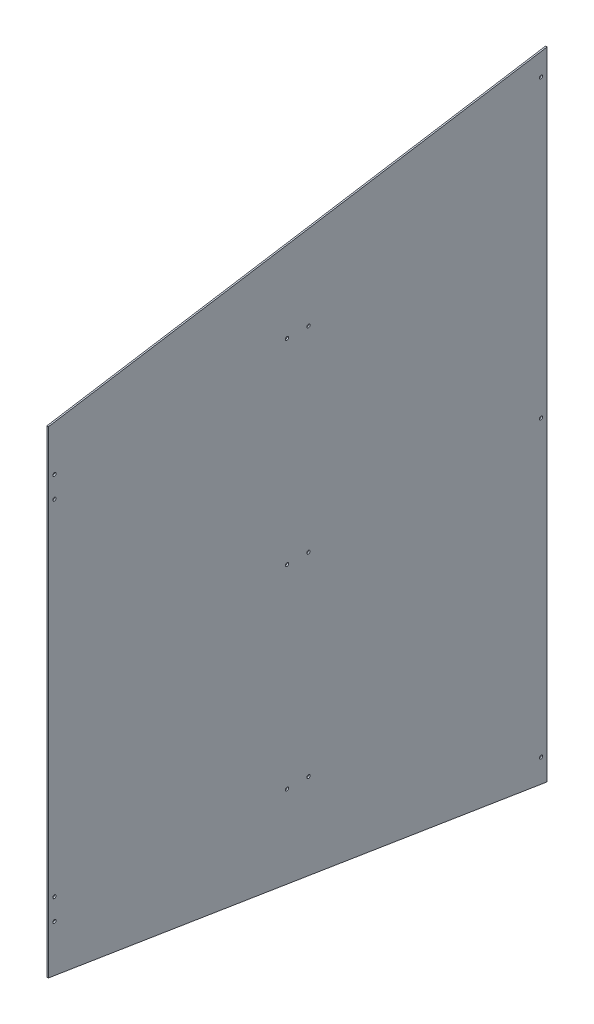
ISO-10303-21;
HEADER;
FILE_DESCRIPTION(('STEP AP214'),'2;1');
FILE_NAME('part.step','',(''),(''),'','','');
FILE_SCHEMA(('AUTOMOTIVE_DESIGN { 1 0 10303 214 1 1 1 1 }'));
ENDSEC;
DATA;
#1=APPLICATION_CONTEXT('core data for automotive mechanical design processes');
#2=APPLICATION_PROTOCOL_DEFINITION('international standard','automotive_design',2000,#1);
#3=PRODUCT_CONTEXT('',#1,'mechanical');
#4=PRODUCT('Part','Part','',(#3));
#5=PRODUCT_RELATED_PRODUCT_CATEGORY('part','',(#4));
#6=PRODUCT_DEFINITION_FORMATION('','',#4);
#7=PRODUCT_DEFINITION_CONTEXT('part definition',#1,'design');
#8=PRODUCT_DEFINITION('design','',#6,#7);
#9=PRODUCT_DEFINITION_SHAPE('','',#8);
#10=(LENGTH_UNIT() NAMED_UNIT(*) SI_UNIT(.MILLI.,.METRE.));
#11=(NAMED_UNIT(*) PLANE_ANGLE_UNIT() SI_UNIT($,.RADIAN.));
#12=(NAMED_UNIT(*) SI_UNIT($,.STERADIAN.) SOLID_ANGLE_UNIT());
#13=UNCERTAINTY_MEASURE_WITH_UNIT(LENGTH_MEASURE(1.E-05),#10,'distance_accuracy_value','');
#14=(GEOMETRIC_REPRESENTATION_CONTEXT(3) GLOBAL_UNCERTAINTY_ASSIGNED_CONTEXT((#13)) GLOBAL_UNIT_ASSIGNED_CONTEXT((#10,
#11,#12)) REPRESENTATION_CONTEXT('',''));
#15=CARTESIAN_POINT('',(0.,0.,0.));
#16=DIRECTION('',(0.,0.,1.));
#17=DIRECTION('',(1.,0.,0.));
#18=AXIS2_PLACEMENT_3D('',#15,#16,#17);
#19=CARTESIAN_POINT('',(3.175,0.,0.));
#20=DIRECTION('',(1.,0.,0.));
#21=DIRECTION('',(0.,0.,-1.));
#22=AXIS2_PLACEMENT_3D('',#19,#20,#21);
#23=PLANE('',#22);
#24=CARTESIAN_POINT('',(3.175,-400.05,1022.35));
#25=DIRECTION('',(1.,0.,0.));
#26=DIRECTION('',(0.,0.,-1.));
#27=AXIS2_PLACEMENT_3D('',#24,#25,#26);
#28=CIRCLE('',#27,3.3655);
#29=CARTESIAN_POINT('',(3.175,-400.05,1018.9845));
#30=VERTEX_POINT('',#29);
#31=EDGE_CURVE('E119',#30,#30,#28,.F.);
#32=ORIENTED_EDGE('',*,*,#31,.T.);
#33=EDGE_LOOP('',(#32));
#34=FACE_BOUND('',#33,.T.);
#35=CARTESIAN_POINT('',(3.175,-355.6,1022.35));
#36=DIRECTION('',(1.,0.,0.));
#37=DIRECTION('',(0.,0.,-1.));
#38=AXIS2_PLACEMENT_3D('',#35,#36,#37);
#39=CIRCLE('',#38,3.3655);
#40=CARTESIAN_POINT('',(3.175,-355.6,1018.9845));
#41=VERTEX_POINT('',#40);
#42=EDGE_CURVE('E122',#41,#41,#39,.F.);
#43=ORIENTED_EDGE('',*,*,#42,.T.);
#44=EDGE_LOOP('',(#43));
#45=FACE_BOUND('',#44,.T.);
#46=CARTESIAN_POINT('',(3.175,358.775,1022.35));
#47=DIRECTION('',(1.,0.,0.));
#48=DIRECTION('',(0.,0.,-1.));
#49=AXIS2_PLACEMENT_3D('',#46,#47,#48);
#50=CIRCLE('',#49,3.3655);
#51=CARTESIAN_POINT('',(3.175,358.775,1018.9845));
#52=VERTEX_POINT('',#51);
#53=EDGE_CURVE('E125',#52,#52,#50,.F.);
#54=ORIENTED_EDGE('',*,*,#53,.T.);
#55=EDGE_LOOP('',(#54));
#56=FACE_BOUND('',#55,.T.);
#57=CARTESIAN_POINT('',(3.175,403.225,1022.35));
#58=DIRECTION('',(1.,0.,0.));
#59=DIRECTION('',(0.,0.,-1.));
#60=AXIS2_PLACEMENT_3D('',#57,#58,#59);
#61=CIRCLE('',#60,3.3655);
#62=CARTESIAN_POINT('',(3.175,403.225,1018.9845));
#63=VERTEX_POINT('',#62);
#64=EDGE_CURVE('E128',#63,#63,#61,.F.);
#65=ORIENTED_EDGE('',*,*,#64,.T.);
#66=EDGE_LOOP('',(#65));
#67=FACE_BOUND('',#66,.T.);
#68=CARTESIAN_POINT('',(3.175,-403.225,539.75));
#69=DIRECTION('',(1.,0.,0.));
#70=DIRECTION('',(0.,0.,-1.));
#71=AXIS2_PLACEMENT_3D('',#68,#69,#70);
#72=CIRCLE('',#71,3.3655);
#73=CARTESIAN_POINT('',(3.175,-403.225,536.3845));
#74=VERTEX_POINT('',#73);
#75=EDGE_CURVE('E131',#74,#74,#72,.F.);
#76=ORIENTED_EDGE('',*,*,#75,.T.);
#77=EDGE_LOOP('',(#76));
#78=FACE_BOUND('',#77,.T.);
#79=CARTESIAN_POINT('',(3.175,-403.225,495.3));
#80=DIRECTION('',(1.,0.,0.));
#81=DIRECTION('',(0.,0.,-1.));
#82=AXIS2_PLACEMENT_3D('',#79,#80,#81);
#83=CIRCLE('',#82,3.3655);
#84=CARTESIAN_POINT('',(3.175,-403.225,491.9345));
#85=VERTEX_POINT('',#84);
#86=EDGE_CURVE('E134',#85,#85,#83,.F.);
#87=ORIENTED_EDGE('',*,*,#86,.T.);
#88=EDGE_LOOP('',(#87));
#89=FACE_BOUND('',#88,.T.);
#90=CARTESIAN_POINT('',(3.175,0.,539.75));
#91=DIRECTION('',(1.,0.,0.));
#92=DIRECTION('',(0.,0.,-1.));
#93=AXIS2_PLACEMENT_3D('',#90,#91,#92);
#94=CIRCLE('',#93,3.3655);
#95=CARTESIAN_POINT('',(3.175,0.,536.3845));
#96=VERTEX_POINT('',#95);
#97=EDGE_CURVE('E137',#96,#96,#94,.F.);
#98=ORIENTED_EDGE('',*,*,#97,.T.);
#99=EDGE_LOOP('',(#98));
#100=FACE_BOUND('',#99,.T.);
#101=CARTESIAN_POINT('',(3.175,0.,495.3));
#102=DIRECTION('',(1.,0.,0.));
#103=DIRECTION('',(0.,0.,-1.));
#104=AXIS2_PLACEMENT_3D('',#101,#102,#103);
#105=CIRCLE('',#104,3.3655);
#106=CARTESIAN_POINT('',(3.175,0.,491.9345));
#107=VERTEX_POINT('',#106);
#108=EDGE_CURVE('E140',#107,#107,#105,.F.);
#109=ORIENTED_EDGE('',*,*,#108,.T.);
#110=EDGE_LOOP('',(#109));
#111=FACE_BOUND('',#110,.T.);
#112=CARTESIAN_POINT('',(3.175,406.4,539.75));
#113=DIRECTION('',(1.,0.,0.));
#114=DIRECTION('',(0.,0.,-1.));
#115=AXIS2_PLACEMENT_3D('',#112,#113,#114);
#116=CIRCLE('',#115,3.3655);
#117=CARTESIAN_POINT('',(3.175,406.4,536.3845));
#118=VERTEX_POINT('',#117);
#119=EDGE_CURVE('E143',#118,#118,#116,.F.);
#120=ORIENTED_EDGE('',*,*,#119,.T.);
#121=EDGE_LOOP('',(#120));
#122=FACE_BOUND('',#121,.T.);
#123=CARTESIAN_POINT('',(3.175,406.4,495.3));
#124=DIRECTION('',(1.,0.,0.));
#125=DIRECTION('',(0.,0.,-1.));
#126=AXIS2_PLACEMENT_3D('',#123,#124,#125);
#127=CIRCLE('',#126,3.3655);
#128=CARTESIAN_POINT('',(3.175,406.4,491.9345));
#129=VERTEX_POINT('',#128);
#130=EDGE_CURVE('E146',#129,#129,#127,.F.);
#131=ORIENTED_EDGE('',*,*,#130,.T.);
#132=EDGE_LOOP('',(#131));
#133=FACE_BOUND('',#132,.T.);
#134=CARTESIAN_POINT('',(3.175,-609.6,12.7));
#135=DIRECTION('',(1.,0.,0.));
#136=DIRECTION('',(0.,0.,-1.));
#137=AXIS2_PLACEMENT_3D('',#134,#135,#136);
#138=CIRCLE('',#137,3.3655);
#139=CARTESIAN_POINT('',(3.175,-609.6,9.3345));
#140=VERTEX_POINT('',#139);
#141=EDGE_CURVE('E149',#140,#140,#138,.F.);
#142=ORIENTED_EDGE('',*,*,#141,.T.);
#143=EDGE_LOOP('',(#142));
#144=FACE_BOUND('',#143,.T.);
#145=CARTESIAN_POINT('',(3.175,0.,12.7));
#146=DIRECTION('',(1.,0.,0.));
#147=DIRECTION('',(0.,0.,-1.));
#148=AXIS2_PLACEMENT_3D('',#145,#146,#147);
#149=CIRCLE('',#148,3.3655);
#150=CARTESIAN_POINT('',(3.175,0.,9.3345));
#151=VERTEX_POINT('',#150);
#152=EDGE_CURVE('E151',#151,#151,#149,.F.);
#153=ORIENTED_EDGE('',*,*,#152,.T.);
#154=EDGE_LOOP('',(#153));
#155=FACE_BOUND('',#154,.T.);
#156=CARTESIAN_POINT('',(3.175,612.775,12.7));
#157=DIRECTION('',(1.,0.,0.));
#158=DIRECTION('',(0.,0.,-1.));
#159=AXIS2_PLACEMENT_3D('',#156,#157,#158);
#160=CIRCLE('',#159,3.3655);
#161=CARTESIAN_POINT('',(3.175,612.775,9.3345));
#162=VERTEX_POINT('',#161);
#163=EDGE_CURVE('E20',#162,#162,#160,.F.);
#164=ORIENTED_EDGE('',*,*,#163,.T.);
#165=EDGE_LOOP('',(#164));
#166=FACE_BOUND('',#165,.T.);
#167=DIRECTION('',(0.,1.,0.));
#168=VECTOR('',#167,1.);
#169=CARTESIAN_POINT('',(3.175,-660.4,0.));
#170=LINE('',#169,#168);
#171=CARTESIAN_POINT('',(3.175,660.4,0.));
#172=VERTEX_POINT('',#171);
#173=CARTESIAN_POINT('',(3.175,-660.399999999999,-1.94289029309402E-13));
#174=VERTEX_POINT('',#173);
#175=EDGE_CURVE('E71',#172,#174,#170,.F.);
#176=ORIENTED_EDGE('',*,*,#175,.F.);
#177=DIRECTION('',(0.,-0.157517910379392,0.987516130455452));
#178=VECTOR('',#177,1.);
#179=CARTESIAN_POINT('',(3.175,660.4,0.));
#180=LINE('',#179,#178);
#181=CARTESIAN_POINT('',(3.175,495.300000000001,1035.05));
#182=VERTEX_POINT('',#181);
#183=EDGE_CURVE('E68',#182,#172,#180,.F.);
#184=ORIENTED_EDGE('',*,*,#183,.F.);
#185=DIRECTION('',(0.,1.,0.));
#186=VECTOR('',#185,1.);
#187=CARTESIAN_POINT('',(3.175,495.3,1035.05));
#188=LINE('',#187,#186);
#189=CARTESIAN_POINT('',(3.175,-495.3,1035.05));
#190=VERTEX_POINT('',#189);
#191=EDGE_CURVE('E59',#190,#182,#188,.T.);
#192=ORIENTED_EDGE('',*,*,#191,.F.);
#193=DIRECTION('',(0.,-0.157517910379392,-0.987516130455452));
#194=VECTOR('',#193,1.);
#195=CARTESIAN_POINT('',(3.175,-495.3,1035.05));
#196=LINE('',#195,#194);
#197=EDGE_CURVE('E54',#174,#190,#196,.F.);
#198=ORIENTED_EDGE('',*,*,#197,.F.);
#199=EDGE_LOOP('',(#176,#184,#192,#198));
#200=FACE_BOUND('',#199,.T.);
#201=ADVANCED_FACE('F17',(#34,#45,#56,#67,#78,#89,#100,#111,#122,#133,#144,#155,#166,#200),#23,.T.);
#202=CARTESIAN_POINT('',(0.,660.4,0.));
#203=DIRECTION('',(0.,0.987516130455452,0.157517910379392));
#204=DIRECTION('',(0.,-0.157517910379392,0.987516130455452));
#205=AXIS2_PLACEMENT_3D('',#202,#203,#204);
#206=PLANE('',#205);
#207=DIRECTION('',(-1.,0.,0.));
#208=VECTOR('',#207,1.);
#209=CARTESIAN_POINT('',(0.,660.4,0.));
#210=LINE('',#209,#208);
#211=CARTESIAN_POINT('',(0.,660.4,0.));
#212=VERTEX_POINT('',#211);
#213=EDGE_CURVE('E159',#212,#172,#210,.F.);
#214=ORIENTED_EDGE('',*,*,#213,.F.);
#215=DIRECTION('',(0.,-0.157517910379397,0.987516130455451));
#216=VECTOR('',#215,1.);
#217=CARTESIAN_POINT('',(0.,660.4,0.));
#218=LINE('',#217,#216);
#219=CARTESIAN_POINT('',(0.,495.300000000002,1035.05));
#220=VERTEX_POINT('',#219);
#221=EDGE_CURVE('E78',#212,#220,#218,.T.);
#222=ORIENTED_EDGE('',*,*,#221,.T.);
#223=DIRECTION('',(1.,0.,0.));
#224=VECTOR('',#223,1.);
#225=CARTESIAN_POINT('',(0.,495.3,1035.05));
#226=LINE('',#225,#224);
#227=EDGE_CURVE('E64',#182,#220,#226,.F.);
#228=ORIENTED_EDGE('',*,*,#227,.F.);
#229=ORIENTED_EDGE('',*,*,#183,.T.);
#230=EDGE_LOOP('',(#214,#222,#228,#229));
#231=FACE_BOUND('',#230,.T.);
#232=ADVANCED_FACE('F77',(#231),#206,.T.);
#233=CARTESIAN_POINT('',(0.,495.3,1035.05));
#234=DIRECTION('',(0.,0.,1.));
#235=DIRECTION('',(1.,0.,0.));
#236=AXIS2_PLACEMENT_3D('',#233,#234,#235);
#237=PLANE('',#236);
#238=ORIENTED_EDGE('',*,*,#227,.T.);
#239=DIRECTION('',(0.,1.,0.));
#240=VECTOR('',#239,1.);
#241=CARTESIAN_POINT('',(0.,0.,1035.05));
#242=LINE('',#241,#240);
#243=CARTESIAN_POINT('',(0.,-495.3,1035.05));
#244=VERTEX_POINT('',#243);
#245=EDGE_CURVE('E170',#220,#244,#242,.F.);
#246=ORIENTED_EDGE('',*,*,#245,.T.);
#247=DIRECTION('',(1.,0.,0.));
#248=VECTOR('',#247,1.);
#249=CARTESIAN_POINT('',(0.,-495.3,1035.05));
#250=LINE('',#249,#248);
#251=EDGE_CURVE('E66',#190,#244,#250,.F.);
#252=ORIENTED_EDGE('',*,*,#251,.F.);
#253=ORIENTED_EDGE('',*,*,#191,.T.);
#254=EDGE_LOOP('',(#238,#246,#252,#253));
#255=FACE_BOUND('',#254,.T.);
#256=ADVANCED_FACE('F61',(#255),#237,.T.);
#257=CARTESIAN_POINT('',(0.,-495.3,1035.05));
#258=DIRECTION('',(0.,-0.987516130455452,0.157517910379392));
#259=DIRECTION('',(0.,-0.157517910379392,-0.987516130455452));
#260=AXIS2_PLACEMENT_3D('',#257,#258,#259);
#261=PLANE('',#260);
#262=ORIENTED_EDGE('',*,*,#251,.T.);
#263=DIRECTION('',(0.,-0.157517910379397,-0.987516130455451));
#264=VECTOR('',#263,1.);
#265=CARTESIAN_POINT('',(0.,-495.3,1035.05));
#266=LINE('',#265,#264);
#267=CARTESIAN_POINT('',(0.,-660.399999999998,-3.05311331771918E-13));
#268=VERTEX_POINT('',#267);
#269=EDGE_CURVE('E167',#244,#268,#266,.T.);
#270=ORIENTED_EDGE('',*,*,#269,.T.);
#271=DIRECTION('',(-1.,0.,0.));
#272=VECTOR('',#271,1.);
#273=CARTESIAN_POINT('',(0.,-660.4,0.));
#274=LINE('',#273,#272);
#275=EDGE_CURVE('E35',#174,#268,#274,.T.);
#276=ORIENTED_EDGE('',*,*,#275,.F.);
#277=ORIENTED_EDGE('',*,*,#197,.T.);
#278=EDGE_LOOP('',(#262,#270,#276,#277));
#279=FACE_BOUND('',#278,.T.);
#280=ADVANCED_FACE('F166',(#279),#261,.T.);
#281=CARTESIAN_POINT('',(0.,-660.4,0.));
#282=DIRECTION('',(0.,0.,-1.));
#283=DIRECTION('',(-1.,0.,0.));
#284=AXIS2_PLACEMENT_3D('',#281,#282,#283);
#285=PLANE('',#284);
#286=ORIENTED_EDGE('',*,*,#275,.T.);
#287=DIRECTION('',(0.,1.,0.));
#288=VECTOR('',#287,1.);
#289=CARTESIAN_POINT('',(0.,0.,0.));
#290=LINE('',#289,#288);
#291=EDGE_CURVE('E118',#268,#212,#290,.T.);
#292=ORIENTED_EDGE('',*,*,#291,.T.);
#293=ORIENTED_EDGE('',*,*,#213,.T.);
#294=ORIENTED_EDGE('',*,*,#175,.T.);
#295=EDGE_LOOP('',(#286,#292,#293,#294));
#296=FACE_BOUND('',#295,.T.);
#297=ADVANCED_FACE('F173',(#296),#285,.T.);
#298=CARTESIAN_POINT('',(3.175,612.775,12.7));
#299=DIRECTION('',(1.,0.,0.));
#300=DIRECTION('',(0.,0.,-1.));
#301=AXIS2_PLACEMENT_3D('',#298,#299,#300);
#302=CYLINDRICAL_SURFACE('',#301,3.3655);
#303=ORIENTED_EDGE('',*,*,#163,.F.);
#304=EDGE_LOOP('',(#303));
#305=FACE_BOUND('',#304,.T.);
#306=CARTESIAN_POINT('',(0.,612.775,12.7));
#307=DIRECTION('',(1.,0.,0.));
#308=DIRECTION('',(0.,0.,-1.));
#309=AXIS2_PLACEMENT_3D('',#306,#307,#308);
#310=CIRCLE('',#309,3.3655);
#311=CARTESIAN_POINT('',(0.,612.775,9.3345));
#312=VERTEX_POINT('',#311);
#313=EDGE_CURVE('E115',#312,#312,#310,.F.);
#314=ORIENTED_EDGE('',*,*,#313,.T.);
#315=EDGE_LOOP('',(#314));
#316=FACE_BOUND('',#315,.T.);
#317=ADVANCED_FACE('F175',(#305,#316),#302,.F.);
#318=CARTESIAN_POINT('',(3.175,0.,12.7));
#319=DIRECTION('',(1.,0.,0.));
#320=DIRECTION('',(0.,0.,-1.));
#321=AXIS2_PLACEMENT_3D('',#318,#319,#320);
#322=CYLINDRICAL_SURFACE('',#321,3.3655);
#323=ORIENTED_EDGE('',*,*,#152,.F.);
#324=EDGE_LOOP('',(#323));
#325=FACE_BOUND('',#324,.T.);
#326=CARTESIAN_POINT('',(0.,0.,12.7));
#327=DIRECTION('',(1.,0.,0.));
#328=DIRECTION('',(0.,0.,-1.));
#329=AXIS2_PLACEMENT_3D('',#326,#327,#328);
#330=CIRCLE('',#329,3.3655);
#331=CARTESIAN_POINT('',(0.,0.,9.3345));
#332=VERTEX_POINT('',#331);
#333=EDGE_CURVE('E112',#332,#332,#330,.F.);
#334=ORIENTED_EDGE('',*,*,#333,.T.);
#335=EDGE_LOOP('',(#334));
#336=FACE_BOUND('',#335,.T.);
#337=ADVANCED_FACE('F182',(#325,#336),#322,.F.);
#338=CARTESIAN_POINT('',(3.175,-609.6,12.7));
#339=DIRECTION('',(1.,0.,0.));
#340=DIRECTION('',(0.,0.,-1.));
#341=AXIS2_PLACEMENT_3D('',#338,#339,#340);
#342=CYLINDRICAL_SURFACE('',#341,3.3655);
#343=ORIENTED_EDGE('',*,*,#141,.F.);
#344=EDGE_LOOP('',(#343));
#345=FACE_BOUND('',#344,.T.);
#346=CARTESIAN_POINT('',(0.,-609.6,12.7));
#347=DIRECTION('',(1.,0.,0.));
#348=DIRECTION('',(0.,0.,-1.));
#349=AXIS2_PLACEMENT_3D('',#346,#347,#348);
#350=CIRCLE('',#349,3.3655);
#351=CARTESIAN_POINT('',(0.,-609.6,9.3345));
#352=VERTEX_POINT('',#351);
#353=EDGE_CURVE('E109',#352,#352,#350,.F.);
#354=ORIENTED_EDGE('',*,*,#353,.T.);
#355=EDGE_LOOP('',(#354));
#356=FACE_BOUND('',#355,.T.);
#357=ADVANCED_FACE('F233',(#345,#356),#342,.F.);
#358=CARTESIAN_POINT('',(3.175,406.4,495.3));
#359=DIRECTION('',(1.,0.,0.));
#360=DIRECTION('',(0.,0.,-1.));
#361=AXIS2_PLACEMENT_3D('',#358,#359,#360);
#362=CYLINDRICAL_SURFACE('',#361,3.3655);
#363=ORIENTED_EDGE('',*,*,#130,.F.);
#364=EDGE_LOOP('',(#363));
#365=FACE_BOUND('',#364,.T.);
#366=CARTESIAN_POINT('',(0.,406.4,495.3));
#367=DIRECTION('',(1.,0.,0.));
#368=DIRECTION('',(0.,0.,-1.));
#369=AXIS2_PLACEMENT_3D('',#366,#367,#368);
#370=CIRCLE('',#369,3.3655);
#371=CARTESIAN_POINT('',(0.,406.4,491.9345));
#372=VERTEX_POINT('',#371);
#373=EDGE_CURVE('E106',#372,#372,#370,.F.);
#374=ORIENTED_EDGE('',*,*,#373,.T.);
#375=EDGE_LOOP('',(#374));
#376=FACE_BOUND('',#375,.T.);
#377=ADVANCED_FACE('F229',(#365,#376),#362,.F.);
#378=CARTESIAN_POINT('',(3.175,406.4,539.75));
#379=DIRECTION('',(1.,0.,0.));
#380=DIRECTION('',(0.,0.,-1.));
#381=AXIS2_PLACEMENT_3D('',#378,#379,#380);
#382=CYLINDRICAL_SURFACE('',#381,3.3655);
#383=ORIENTED_EDGE('',*,*,#119,.F.);
#384=EDGE_LOOP('',(#383));
#385=FACE_BOUND('',#384,.T.);
#386=CARTESIAN_POINT('',(0.,406.4,539.75));
#387=DIRECTION('',(1.,0.,0.));
#388=DIRECTION('',(0.,0.,-1.));
#389=AXIS2_PLACEMENT_3D('',#386,#387,#388);
#390=CIRCLE('',#389,3.3655);
#391=CARTESIAN_POINT('',(0.,406.4,536.3845));
#392=VERTEX_POINT('',#391);
#393=EDGE_CURVE('E103',#392,#392,#390,.F.);
#394=ORIENTED_EDGE('',*,*,#393,.T.);
#395=EDGE_LOOP('',(#394));
#396=FACE_BOUND('',#395,.T.);
#397=ADVANCED_FACE('F225',(#385,#396),#382,.F.);
#398=CARTESIAN_POINT('',(3.175,0.,495.3));
#399=DIRECTION('',(1.,0.,0.));
#400=DIRECTION('',(0.,0.,-1.));
#401=AXIS2_PLACEMENT_3D('',#398,#399,#400);
#402=CYLINDRICAL_SURFACE('',#401,3.3655);
#403=ORIENTED_EDGE('',*,*,#108,.F.);
#404=EDGE_LOOP('',(#403));
#405=FACE_BOUND('',#404,.T.);
#406=CARTESIAN_POINT('',(0.,0.,495.3));
#407=DIRECTION('',(1.,0.,0.));
#408=DIRECTION('',(0.,0.,-1.));
#409=AXIS2_PLACEMENT_3D('',#406,#407,#408);
#410=CIRCLE('',#409,3.3655);
#411=CARTESIAN_POINT('',(0.,0.,491.9345));
#412=VERTEX_POINT('',#411);
#413=EDGE_CURVE('E100',#412,#412,#410,.F.);
#414=ORIENTED_EDGE('',*,*,#413,.T.);
#415=EDGE_LOOP('',(#414));
#416=FACE_BOUND('',#415,.T.);
#417=ADVANCED_FACE('F221',(#405,#416),#402,.F.);
#418=CARTESIAN_POINT('',(3.175,0.,539.75));
#419=DIRECTION('',(1.,0.,0.));
#420=DIRECTION('',(0.,0.,-1.));
#421=AXIS2_PLACEMENT_3D('',#418,#419,#420);
#422=CYLINDRICAL_SURFACE('',#421,3.3655);
#423=ORIENTED_EDGE('',*,*,#97,.F.);
#424=EDGE_LOOP('',(#423));
#425=FACE_BOUND('',#424,.T.);
#426=CARTESIAN_POINT('',(0.,0.,539.75));
#427=DIRECTION('',(1.,0.,0.));
#428=DIRECTION('',(0.,0.,-1.));
#429=AXIS2_PLACEMENT_3D('',#426,#427,#428);
#430=CIRCLE('',#429,3.3655);
#431=CARTESIAN_POINT('',(0.,0.,536.3845));
#432=VERTEX_POINT('',#431);
#433=EDGE_CURVE('E97',#432,#432,#430,.F.);
#434=ORIENTED_EDGE('',*,*,#433,.T.);
#435=EDGE_LOOP('',(#434));
#436=FACE_BOUND('',#435,.T.);
#437=ADVANCED_FACE('F217',(#425,#436),#422,.F.);
#438=CARTESIAN_POINT('',(3.175,-403.225,495.3));
#439=DIRECTION('',(1.,0.,0.));
#440=DIRECTION('',(0.,0.,-1.));
#441=AXIS2_PLACEMENT_3D('',#438,#439,#440);
#442=CYLINDRICAL_SURFACE('',#441,3.3655);
#443=ORIENTED_EDGE('',*,*,#86,.F.);
#444=EDGE_LOOP('',(#443));
#445=FACE_BOUND('',#444,.T.);
#446=CARTESIAN_POINT('',(0.,-403.225,495.3));
#447=DIRECTION('',(1.,0.,0.));
#448=DIRECTION('',(0.,0.,-1.));
#449=AXIS2_PLACEMENT_3D('',#446,#447,#448);
#450=CIRCLE('',#449,3.3655);
#451=CARTESIAN_POINT('',(0.,-403.225,491.9345));
#452=VERTEX_POINT('',#451);
#453=EDGE_CURVE('E94',#452,#452,#450,.F.);
#454=ORIENTED_EDGE('',*,*,#453,.T.);
#455=EDGE_LOOP('',(#454));
#456=FACE_BOUND('',#455,.T.);
#457=ADVANCED_FACE('F213',(#445,#456),#442,.F.);
#458=CARTESIAN_POINT('',(3.175,-403.225,539.75));
#459=DIRECTION('',(1.,0.,0.));
#460=DIRECTION('',(0.,0.,-1.));
#461=AXIS2_PLACEMENT_3D('',#458,#459,#460);
#462=CYLINDRICAL_SURFACE('',#461,3.3655);
#463=ORIENTED_EDGE('',*,*,#75,.F.);
#464=EDGE_LOOP('',(#463));
#465=FACE_BOUND('',#464,.T.);
#466=CARTESIAN_POINT('',(0.,-403.225,539.75));
#467=DIRECTION('',(1.,0.,0.));
#468=DIRECTION('',(0.,0.,-1.));
#469=AXIS2_PLACEMENT_3D('',#466,#467,#468);
#470=CIRCLE('',#469,3.3655);
#471=CARTESIAN_POINT('',(0.,-403.225,536.3845));
#472=VERTEX_POINT('',#471);
#473=EDGE_CURVE('E91',#472,#472,#470,.F.);
#474=ORIENTED_EDGE('',*,*,#473,.T.);
#475=EDGE_LOOP('',(#474));
#476=FACE_BOUND('',#475,.T.);
#477=ADVANCED_FACE('F209',(#465,#476),#462,.F.);
#478=CARTESIAN_POINT('',(3.175,403.225,1022.35));
#479=DIRECTION('',(1.,0.,0.));
#480=DIRECTION('',(0.,0.,-1.));
#481=AXIS2_PLACEMENT_3D('',#478,#479,#480);
#482=CYLINDRICAL_SURFACE('',#481,3.3655);
#483=ORIENTED_EDGE('',*,*,#64,.F.);
#484=EDGE_LOOP('',(#483));
#485=FACE_BOUND('',#484,.T.);
#486=CARTESIAN_POINT('',(0.,403.225,1022.35));
#487=DIRECTION('',(1.,0.,0.));
#488=DIRECTION('',(0.,0.,-1.));
#489=AXIS2_PLACEMENT_3D('',#486,#487,#488);
#490=CIRCLE('',#489,3.3655);
#491=CARTESIAN_POINT('',(0.,403.225,1018.9845));
#492=VERTEX_POINT('',#491);
#493=EDGE_CURVE('E88',#492,#492,#490,.F.);
#494=ORIENTED_EDGE('',*,*,#493,.T.);
#495=EDGE_LOOP('',(#494));
#496=FACE_BOUND('',#495,.T.);
#497=ADVANCED_FACE('F205',(#485,#496),#482,.F.);
#498=CARTESIAN_POINT('',(3.175,358.775,1022.35));
#499=DIRECTION('',(1.,0.,0.));
#500=DIRECTION('',(0.,0.,-1.));
#501=AXIS2_PLACEMENT_3D('',#498,#499,#500);
#502=CYLINDRICAL_SURFACE('',#501,3.3655);
#503=ORIENTED_EDGE('',*,*,#53,.F.);
#504=EDGE_LOOP('',(#503));
#505=FACE_BOUND('',#504,.T.);
#506=CARTESIAN_POINT('',(0.,358.775,1022.35));
#507=DIRECTION('',(1.,0.,0.));
#508=DIRECTION('',(0.,0.,-1.));
#509=AXIS2_PLACEMENT_3D('',#506,#507,#508);
#510=CIRCLE('',#509,3.3655);
#511=CARTESIAN_POINT('',(0.,358.775,1018.9845));
#512=VERTEX_POINT('',#511);
#513=EDGE_CURVE('E85',#512,#512,#510,.F.);
#514=ORIENTED_EDGE('',*,*,#513,.T.);
#515=EDGE_LOOP('',(#514));
#516=FACE_BOUND('',#515,.T.);
#517=ADVANCED_FACE('F201',(#505,#516),#502,.F.);
#518=CARTESIAN_POINT('',(3.175,-355.6,1022.35));
#519=DIRECTION('',(1.,0.,0.));
#520=DIRECTION('',(0.,0.,-1.));
#521=AXIS2_PLACEMENT_3D('',#518,#519,#520);
#522=CYLINDRICAL_SURFACE('',#521,3.3655);
#523=ORIENTED_EDGE('',*,*,#42,.F.);
#524=EDGE_LOOP('',(#523));
#525=FACE_BOUND('',#524,.T.);
#526=CARTESIAN_POINT('',(0.,-355.6,1022.35));
#527=DIRECTION('',(1.,0.,0.));
#528=DIRECTION('',(0.,0.,-1.));
#529=AXIS2_PLACEMENT_3D('',#526,#527,#528);
#530=CIRCLE('',#529,3.3655);
#531=CARTESIAN_POINT('',(0.,-355.6,1018.9845));
#532=VERTEX_POINT('',#531);
#533=EDGE_CURVE('E26',#532,#532,#530,.F.);
#534=ORIENTED_EDGE('',*,*,#533,.T.);
#535=EDGE_LOOP('',(#534));
#536=FACE_BOUND('',#535,.T.);
#537=ADVANCED_FACE('F193',(#525,#536),#522,.F.);
#538=CARTESIAN_POINT('',(3.175,-400.05,1022.35));
#539=DIRECTION('',(1.,0.,0.));
#540=DIRECTION('',(0.,0.,-1.));
#541=AXIS2_PLACEMENT_3D('',#538,#539,#540);
#542=CYLINDRICAL_SURFACE('',#541,3.3655);
#543=ORIENTED_EDGE('',*,*,#31,.F.);
#544=EDGE_LOOP('',(#543));
#545=FACE_BOUND('',#544,.T.);
#546=CARTESIAN_POINT('',(0.,-400.05,1022.35));
#547=DIRECTION('',(1.,0.,0.));
#548=DIRECTION('',(0.,0.,-1.));
#549=AXIS2_PLACEMENT_3D('',#546,#547,#548);
#550=CIRCLE('',#549,3.3655);
#551=CARTESIAN_POINT('',(0.,-400.05,1018.9845));
#552=VERTEX_POINT('',#551);
#553=EDGE_CURVE('E11',#552,#552,#550,.F.);
#554=ORIENTED_EDGE('',*,*,#553,.T.);
#555=EDGE_LOOP('',(#554));
#556=FACE_BOUND('',#555,.T.);
#557=ADVANCED_FACE('F187',(#545,#556),#542,.F.);
#558=CARTESIAN_POINT('',(0.,0.,0.));
#559=DIRECTION('',(1.,0.,0.));
#560=DIRECTION('',(0.,0.,-1.));
#561=AXIS2_PLACEMENT_3D('',#558,#559,#560);
#562=PLANE('',#561);
#563=ORIENTED_EDGE('',*,*,#553,.F.);
#564=EDGE_LOOP('',(#563));
#565=FACE_BOUND('',#564,.T.);
#566=ORIENTED_EDGE('',*,*,#533,.F.);
#567=EDGE_LOOP('',(#566));
#568=FACE_BOUND('',#567,.T.);
#569=ORIENTED_EDGE('',*,*,#513,.F.);
#570=EDGE_LOOP('',(#569));
#571=FACE_BOUND('',#570,.T.);
#572=ORIENTED_EDGE('',*,*,#493,.F.);
#573=EDGE_LOOP('',(#572));
#574=FACE_BOUND('',#573,.T.);
#575=ORIENTED_EDGE('',*,*,#473,.F.);
#576=EDGE_LOOP('',(#575));
#577=FACE_BOUND('',#576,.T.);
#578=ORIENTED_EDGE('',*,*,#453,.F.);
#579=EDGE_LOOP('',(#578));
#580=FACE_BOUND('',#579,.T.);
#581=ORIENTED_EDGE('',*,*,#433,.F.);
#582=EDGE_LOOP('',(#581));
#583=FACE_BOUND('',#582,.T.);
#584=ORIENTED_EDGE('',*,*,#413,.F.);
#585=EDGE_LOOP('',(#584));
#586=FACE_BOUND('',#585,.T.);
#587=ORIENTED_EDGE('',*,*,#393,.F.);
#588=EDGE_LOOP('',(#587));
#589=FACE_BOUND('',#588,.T.);
#590=ORIENTED_EDGE('',*,*,#373,.F.);
#591=EDGE_LOOP('',(#590));
#592=FACE_BOUND('',#591,.T.);
#593=ORIENTED_EDGE('',*,*,#353,.F.);
#594=EDGE_LOOP('',(#593));
#595=FACE_BOUND('',#594,.T.);
#596=ORIENTED_EDGE('',*,*,#333,.F.);
#597=EDGE_LOOP('',(#596));
#598=FACE_BOUND('',#597,.T.);
#599=ORIENTED_EDGE('',*,*,#313,.F.);
#600=EDGE_LOOP('',(#599));
#601=FACE_BOUND('',#600,.T.);
#602=ORIENTED_EDGE('',*,*,#269,.F.);
#603=ORIENTED_EDGE('',*,*,#245,.F.);
#604=ORIENTED_EDGE('',*,*,#221,.F.);
#605=ORIENTED_EDGE('',*,*,#291,.F.);
#606=EDGE_LOOP('',(#602,#603,#604,#605));
#607=FACE_BOUND('',#606,.T.);
#608=ADVANCED_FACE('F169',(#565,#568,#571,#574,#577,#580,#583,#586,#589,#592,#595,#598,#601,
#607),#562,.F.);
#609=CLOSED_SHELL('',(#201,#232,#256,#280,#297,#317,#337,#357,#377,#397,#417,#437,#457,#477,
#497,#517,#537,#557,#608));
#610=MANIFOLD_SOLID_BREP('B1',#609);
#611=ADVANCED_BREP_SHAPE_REPRESENTATION('',(#18,#610),#14);
#612=SHAPE_DEFINITION_REPRESENTATION(#9,#611);
ENDSEC;
END-ISO-10303-21;
